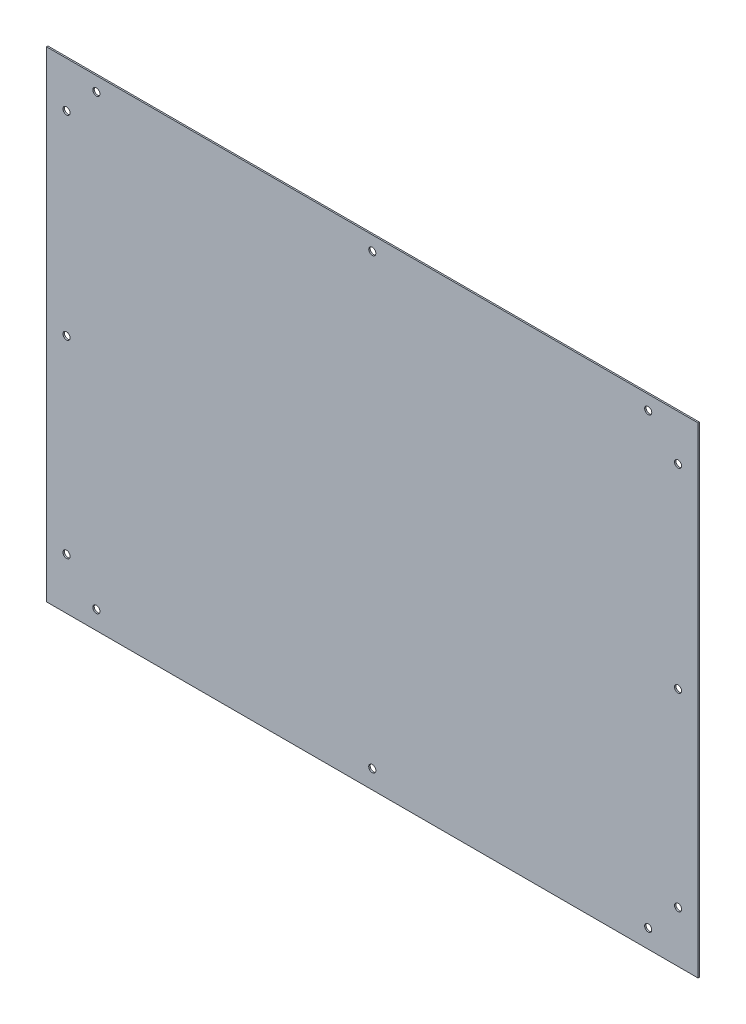
ISO-10303-21;
HEADER;
FILE_DESCRIPTION(('STEP AP214'),'2;1');
FILE_NAME('part.step','',(''),(''),'','','');
FILE_SCHEMA(('AUTOMOTIVE_DESIGN { 1 0 10303 214 1 1 1 1 }'));
ENDSEC;
DATA;
#1=APPLICATION_CONTEXT('core data for automotive mechanical design processes');
#2=APPLICATION_PROTOCOL_DEFINITION('international standard','automotive_design',2000,#1);
#3=PRODUCT_CONTEXT('',#1,'mechanical');
#4=PRODUCT('Part','Part','',(#3));
#5=PRODUCT_RELATED_PRODUCT_CATEGORY('part','',(#4));
#6=PRODUCT_DEFINITION_FORMATION('','',#4);
#7=PRODUCT_DEFINITION_CONTEXT('part definition',#1,'design');
#8=PRODUCT_DEFINITION('design','',#6,#7);
#9=PRODUCT_DEFINITION_SHAPE('','',#8);
#10=(LENGTH_UNIT() NAMED_UNIT(*) SI_UNIT(.MILLI.,.METRE.));
#11=(NAMED_UNIT(*) PLANE_ANGLE_UNIT() SI_UNIT($,.RADIAN.));
#12=(NAMED_UNIT(*) SI_UNIT($,.STERADIAN.) SOLID_ANGLE_UNIT());
#13=UNCERTAINTY_MEASURE_WITH_UNIT(LENGTH_MEASURE(1.E-05),#10,'distance_accuracy_value','');
#14=(GEOMETRIC_REPRESENTATION_CONTEXT(3) GLOBAL_UNCERTAINTY_ASSIGNED_CONTEXT((#13)) GLOBAL_UNIT_ASSIGNED_CONTEXT((#10,
#11,#12)) REPRESENTATION_CONTEXT('',''));
#15=CARTESIAN_POINT('',(0.,0.,0.));
#16=DIRECTION('',(0.,0.,1.));
#17=DIRECTION('',(1.,0.,0.));
#18=AXIS2_PLACEMENT_3D('',#15,#16,#17);
#19=CARTESIAN_POINT('',(229.,169.,1.));
#20=DIRECTION('',(-1.,0.,0.));
#21=DIRECTION('',(0.,-1.,0.));
#22=AXIS2_PLACEMENT_3D('',#19,#20,#21);
#23=PLANE('',#22);
#24=DIRECTION('',(0.,1.,0.));
#25=VECTOR('',#24,1.);
#26=CARTESIAN_POINT('',(229.,169.,0.));
#27=LINE('',#26,#25);
#28=CARTESIAN_POINT('',(229.,-169.,0.));
#29=VERTEX_POINT('',#28);
#30=CARTESIAN_POINT('',(229.,169.,0.));
#31=VERTEX_POINT('',#30);
#32=EDGE_CURVE('E112',#29,#31,#27,.T.);
#33=ORIENTED_EDGE('',*,*,#32,.T.);
#34=DIRECTION('',(0.,0.,-1.));
#35=VECTOR('',#34,1.);
#36=CARTESIAN_POINT('',(229.,169.,1.));
#37=LINE('',#36,#35);
#38=CARTESIAN_POINT('',(229.,169.,1.));
#39=VERTEX_POINT('',#38);
#40=EDGE_CURVE('E11',#39,#31,#37,.T.);
#41=ORIENTED_EDGE('',*,*,#40,.F.);
#42=DIRECTION('',(0.,1.,0.));
#43=VECTOR('',#42,1.);
#44=CARTESIAN_POINT('',(229.,169.,1.));
#45=LINE('',#44,#43);
#46=CARTESIAN_POINT('',(229.,-169.,1.));
#47=VERTEX_POINT('',#46);
#48=EDGE_CURVE('E96',#47,#39,#45,.T.);
#49=ORIENTED_EDGE('',*,*,#48,.F.);
#50=DIRECTION('',(0.,0.,-1.));
#51=VECTOR('',#50,1.);
#52=CARTESIAN_POINT('',(229.,-169.,1.));
#53=LINE('',#52,#51);
#54=EDGE_CURVE('E108',#47,#29,#53,.T.);
#55=ORIENTED_EDGE('',*,*,#54,.T.);
#56=EDGE_LOOP('',(#33,#41,#49,#55));
#57=FACE_BOUND('',#56,.T.);
#58=ADVANCED_FACE('F44',(#57),#23,.F.);
#59=CARTESIAN_POINT('',(-229.,169.,1.));
#60=DIRECTION('',(0.,-1.,0.));
#61=DIRECTION('',(0.,0.,-1.));
#62=AXIS2_PLACEMENT_3D('',#59,#60,#61);
#63=PLANE('',#62);
#64=DIRECTION('',(-1.,0.,0.));
#65=VECTOR('',#64,1.);
#66=CARTESIAN_POINT('',(-229.,169.,0.));
#67=LINE('',#66,#65);
#68=CARTESIAN_POINT('',(-229.,169.,0.));
#69=VERTEX_POINT('',#68);
#70=EDGE_CURVE('E101',#31,#69,#67,.T.);
#71=ORIENTED_EDGE('',*,*,#70,.T.);
#72=DIRECTION('',(0.,0.,-1.));
#73=VECTOR('',#72,1.);
#74=CARTESIAN_POINT('',(-229.,169.,1.));
#75=LINE('',#74,#73);
#76=CARTESIAN_POINT('',(-229.,169.,1.));
#77=VERTEX_POINT('',#76);
#78=EDGE_CURVE('E53',#77,#69,#75,.T.);
#79=ORIENTED_EDGE('',*,*,#78,.F.);
#80=DIRECTION('',(-1.,0.,0.));
#81=VECTOR('',#80,1.);
#82=CARTESIAN_POINT('',(-229.,169.,1.));
#83=LINE('',#82,#81);
#84=EDGE_CURVE('E91',#39,#77,#83,.T.);
#85=ORIENTED_EDGE('',*,*,#84,.F.);
#86=ORIENTED_EDGE('',*,*,#40,.T.);
#87=EDGE_LOOP('',(#71,#79,#85,#86));
#88=FACE_BOUND('',#87,.T.);
#89=ADVANCED_FACE('F100',(#88),#63,.F.);
#90=CARTESIAN_POINT('',(-229.,169.,1.));
#91=DIRECTION('',(1.,0.,0.));
#92=DIRECTION('',(0.,0.,-1.));
#93=AXIS2_PLACEMENT_3D('',#90,#91,#92);
#94=PLANE('',#93);
#95=DIRECTION('',(0.,-1.,0.));
#96=VECTOR('',#95,1.);
#97=CARTESIAN_POINT('',(-229.,169.,0.));
#98=LINE('',#97,#96);
#99=CARTESIAN_POINT('',(-229.,-169.,0.));
#100=VERTEX_POINT('',#99);
#101=EDGE_CURVE('E78',#69,#100,#98,.T.);
#102=ORIENTED_EDGE('',*,*,#101,.T.);
#103=DIRECTION('',(0.,0.,-1.));
#104=VECTOR('',#103,1.);
#105=CARTESIAN_POINT('',(-229.,-169.,1.));
#106=LINE('',#105,#104);
#107=CARTESIAN_POINT('',(-229.,-169.,1.));
#108=VERTEX_POINT('',#107);
#109=EDGE_CURVE('E103',#108,#100,#106,.T.);
#110=ORIENTED_EDGE('',*,*,#109,.F.);
#111=DIRECTION('',(0.,-1.,0.));
#112=VECTOR('',#111,1.);
#113=CARTESIAN_POINT('',(-229.,169.,1.));
#114=LINE('',#113,#112);
#115=EDGE_CURVE('E94',#77,#108,#114,.T.);
#116=ORIENTED_EDGE('',*,*,#115,.F.);
#117=ORIENTED_EDGE('',*,*,#78,.T.);
#118=EDGE_LOOP('',(#102,#110,#116,#117));
#119=FACE_BOUND('',#118,.T.);
#120=ADVANCED_FACE('F104',(#119),#94,.F.);
#121=CARTESIAN_POINT('',(-229.,-169.,1.));
#122=DIRECTION('',(0.,1.,0.));
#123=DIRECTION('',(0.,0.,1.));
#124=AXIS2_PLACEMENT_3D('',#121,#122,#123);
#125=PLANE('',#124);
#126=DIRECTION('',(1.,0.,0.));
#127=VECTOR('',#126,1.);
#128=CARTESIAN_POINT('',(-229.,-169.,0.));
#129=LINE('',#128,#127);
#130=EDGE_CURVE('E84',#100,#29,#129,.T.);
#131=ORIENTED_EDGE('',*,*,#130,.T.);
#132=ORIENTED_EDGE('',*,*,#54,.F.);
#133=DIRECTION('',(1.,0.,0.));
#134=VECTOR('',#133,1.);
#135=CARTESIAN_POINT('',(-229.,-169.,1.));
#136=LINE('',#135,#134);
#137=EDGE_CURVE('E61',#108,#47,#136,.T.);
#138=ORIENTED_EDGE('',*,*,#137,.F.);
#139=ORIENTED_EDGE('',*,*,#109,.T.);
#140=EDGE_LOOP('',(#131,#132,#138,#139));
#141=FACE_BOUND('',#140,.T.);
#142=ADVANCED_FACE('F126',(#141),#125,.F.);
#143=CARTESIAN_POINT('',(0.,0.,1.));
#144=DIRECTION('',(0.,0.,1.));
#145=DIRECTION('',(1.,0.,0.));
#146=AXIS2_PLACEMENT_3D('',#143,#144,#145);
#147=PLANE('',#146);
#148=CARTESIAN_POINT('',(215.,-133.,1.));
#149=DIRECTION('',(0.,0.,1.));
#150=DIRECTION('',(1.,0.,0.));
#151=AXIS2_PLACEMENT_3D('',#148,#149,#150);
#152=CIRCLE('',#151,2.50000000000002);
#153=CARTESIAN_POINT('',(217.5,-133.,1.));
#154=VERTEX_POINT('',#153);
#155=EDGE_CURVE('E177',#154,#154,#152,.T.);
#156=ORIENTED_EDGE('',*,*,#155,.F.);
#157=EDGE_LOOP('',(#156));
#158=FACE_BOUND('',#157,.T.);
#159=CARTESIAN_POINT('',(215.,0.,1.));
#160=DIRECTION('',(0.,0.,1.));
#161=DIRECTION('',(1.,0.,0.));
#162=AXIS2_PLACEMENT_3D('',#159,#160,#161);
#163=CIRCLE('',#162,2.50000000000002);
#164=CARTESIAN_POINT('',(217.5,0.,1.));
#165=VERTEX_POINT('',#164);
#166=EDGE_CURVE('E186',#165,#165,#163,.T.);
#167=ORIENTED_EDGE('',*,*,#166,.F.);
#168=EDGE_LOOP('',(#167));
#169=FACE_BOUND('',#168,.T.);
#170=CARTESIAN_POINT('',(-215.,137.,1.));
#171=DIRECTION('',(0.,0.,1.));
#172=DIRECTION('',(1.,0.,0.));
#173=AXIS2_PLACEMENT_3D('',#170,#171,#172);
#174=CIRCLE('',#173,2.49999999999997);
#175=CARTESIAN_POINT('',(-212.5,137.,1.));
#176=VERTEX_POINT('',#175);
#177=EDGE_CURVE('E194',#176,#176,#174,.T.);
#178=ORIENTED_EDGE('',*,*,#177,.F.);
#179=EDGE_LOOP('',(#178));
#180=FACE_BOUND('',#179,.T.);
#181=CARTESIAN_POINT('',(-215.,-133.,1.));
#182=DIRECTION('',(0.,0.,1.));
#183=DIRECTION('',(1.,0.,0.));
#184=AXIS2_PLACEMENT_3D('',#181,#182,#183);
#185=CIRCLE('',#184,2.49999999999935);
#186=CARTESIAN_POINT('',(-212.500000000001,-133.,1.));
#187=VERTEX_POINT('',#186);
#188=EDGE_CURVE('E146',#187,#187,#185,.T.);
#189=ORIENTED_EDGE('',*,*,#188,.F.);
#190=EDGE_LOOP('',(#189));
#191=FACE_BOUND('',#190,.T.);
#192=CARTESIAN_POINT('',(-215.,0.,1.));
#193=DIRECTION('',(0.,0.,1.));
#194=DIRECTION('',(1.,0.,0.));
#195=AXIS2_PLACEMENT_3D('',#192,#193,#194);
#196=CIRCLE('',#195,2.49999999999997);
#197=CARTESIAN_POINT('',(-212.5,0.,1.));
#198=VERTEX_POINT('',#197);
#199=EDGE_CURVE('E145',#198,#198,#196,.T.);
#200=ORIENTED_EDGE('',*,*,#199,.F.);
#201=EDGE_LOOP('',(#200));
#202=FACE_BOUND('',#201,.T.);
#203=CARTESIAN_POINT('',(194.,159.,1.));
#204=DIRECTION('',(0.,0.,1.));
#205=DIRECTION('',(1.,0.,0.));
#206=AXIS2_PLACEMENT_3D('',#203,#204,#205);
#207=CIRCLE('',#206,2.50000000000026);
#208=CARTESIAN_POINT('',(196.5,159.,1.));
#209=VERTEX_POINT('',#208);
#210=EDGE_CURVE('E154',#209,#209,#207,.T.);
#211=ORIENTED_EDGE('',*,*,#210,.F.);
#212=EDGE_LOOP('',(#211));
#213=FACE_BOUND('',#212,.T.);
#214=CARTESIAN_POINT('',(193.997422663292,-156.,1.));
#215=DIRECTION('',(0.,0.,1.));
#216=DIRECTION('',(1.,0.,0.));
#217=AXIS2_PLACEMENT_3D('',#214,#215,#216);
#218=CIRCLE('',#217,2.50000000000008);
#219=CARTESIAN_POINT('',(196.497422663292,-156.,1.));
#220=VERTEX_POINT('',#219);
#221=EDGE_CURVE('E162',#220,#220,#218,.T.);
#222=ORIENTED_EDGE('',*,*,#221,.F.);
#223=EDGE_LOOP('',(#222));
#224=FACE_BOUND('',#223,.T.);
#225=CARTESIAN_POINT('',(-194.002577336708,-156.,1.));
#226=DIRECTION('',(0.,0.,1.));
#227=DIRECTION('',(1.,0.,0.));
#228=AXIS2_PLACEMENT_3D('',#225,#226,#227);
#229=CIRCLE('',#228,2.50000000000002);
#230=CARTESIAN_POINT('',(-191.502577336708,-156.,1.));
#231=VERTEX_POINT('',#230);
#232=EDGE_CURVE('E137',#231,#231,#229,.T.);
#233=ORIENTED_EDGE('',*,*,#232,.F.);
#234=EDGE_LOOP('',(#233));
#235=FACE_BOUND('',#234,.T.);
#236=CARTESIAN_POINT('',(215.,137.,1.));
#237=DIRECTION('',(0.,0.,1.));
#238=DIRECTION('',(1.,0.,0.));
#239=AXIS2_PLACEMENT_3D('',#236,#237,#238);
#240=CIRCLE('',#239,2.50000000000002);
#241=CARTESIAN_POINT('',(217.5,137.,1.));
#242=VERTEX_POINT('',#241);
#243=EDGE_CURVE('E178',#242,#242,#240,.T.);
#244=ORIENTED_EDGE('',*,*,#243,.F.);
#245=EDGE_LOOP('',(#244));
#246=FACE_BOUND('',#245,.T.);
#247=CARTESIAN_POINT('',(0.,159.,1.));
#248=DIRECTION('',(0.,0.,1.));
#249=DIRECTION('',(1.,0.,0.));
#250=AXIS2_PLACEMENT_3D('',#247,#248,#249);
#251=CIRCLE('',#250,2.5);
#252=CARTESIAN_POINT('',(2.49999999999996,159.,1.));
#253=VERTEX_POINT('',#252);
#254=EDGE_CURVE('E217',#253,#253,#251,.T.);
#255=ORIENTED_EDGE('',*,*,#254,.F.);
#256=EDGE_LOOP('',(#255));
#257=FACE_BOUND('',#256,.T.);
#258=CARTESIAN_POINT('',(-0.00257733670794291,-156.,1.));
#259=DIRECTION('',(0.,0.,1.));
#260=DIRECTION('',(1.,0.,0.));
#261=AXIS2_PLACEMENT_3D('',#258,#259,#260);
#262=CIRCLE('',#261,2.50000000000001);
#263=CARTESIAN_POINT('',(2.49742266329207,-156.,1.));
#264=VERTEX_POINT('',#263);
#265=EDGE_CURVE('E209',#264,#264,#262,.T.);
#266=ORIENTED_EDGE('',*,*,#265,.F.);
#267=EDGE_LOOP('',(#266));
#268=FACE_BOUND('',#267,.T.);
#269=CARTESIAN_POINT('',(-194.,159.,1.));
#270=DIRECTION('',(0.,0.,1.));
#271=DIRECTION('',(1.,0.,0.));
#272=AXIS2_PLACEMENT_3D('',#269,#270,#271);
#273=CIRCLE('',#272,2.49999999999997);
#274=CARTESIAN_POINT('',(-191.5,159.,1.));
#275=VERTEX_POINT('',#274);
#276=EDGE_CURVE('E133',#275,#275,#273,.T.);
#277=ORIENTED_EDGE('',*,*,#276,.F.);
#278=EDGE_LOOP('',(#277));
#279=FACE_BOUND('',#278,.T.);
#280=ORIENTED_EDGE('',*,*,#48,.T.);
#281=ORIENTED_EDGE('',*,*,#84,.T.);
#282=ORIENTED_EDGE('',*,*,#115,.T.);
#283=ORIENTED_EDGE('',*,*,#137,.T.);
#284=EDGE_LOOP('',(#280,#281,#282,#283));
#285=FACE_BOUND('',#284,.T.);
#286=ADVANCED_FACE('F92',(#158,#169,#180,#191,#202,#213,#224,#235,#246,#257,#268,#279,#285),
#147,.T.);
#287=CARTESIAN_POINT('',(0.,0.,0.));
#288=DIRECTION('',(0.,0.,1.));
#289=DIRECTION('',(1.,0.,0.));
#290=AXIS2_PLACEMENT_3D('',#287,#288,#289);
#291=PLANE('',#290);
#292=CARTESIAN_POINT('',(215.,-133.,0.));
#293=DIRECTION('',(0.,0.,1.));
#294=DIRECTION('',(1.,0.,0.));
#295=AXIS2_PLACEMENT_3D('',#292,#293,#294);
#296=CIRCLE('',#295,2.50000000000002);
#297=CARTESIAN_POINT('',(217.5,-133.,0.));
#298=VERTEX_POINT('',#297);
#299=EDGE_CURVE('E173',#298,#298,#296,.T.);
#300=ORIENTED_EDGE('',*,*,#299,.T.);
#301=EDGE_LOOP('',(#300));
#302=FACE_BOUND('',#301,.T.);
#303=CARTESIAN_POINT('',(215.,0.,0.));
#304=DIRECTION('',(0.,0.,1.));
#305=DIRECTION('',(1.,0.,0.));
#306=AXIS2_PLACEMENT_3D('',#303,#304,#305);
#307=CIRCLE('',#306,2.50000000000002);
#308=CARTESIAN_POINT('',(217.5,0.,0.));
#309=VERTEX_POINT('',#308);
#310=EDGE_CURVE('E182',#309,#309,#307,.T.);
#311=ORIENTED_EDGE('',*,*,#310,.T.);
#312=EDGE_LOOP('',(#311));
#313=FACE_BOUND('',#312,.T.);
#314=CARTESIAN_POINT('',(-215.,137.,0.));
#315=DIRECTION('',(0.,0.,1.));
#316=DIRECTION('',(1.,0.,0.));
#317=AXIS2_PLACEMENT_3D('',#314,#315,#316);
#318=CIRCLE('',#317,2.49999999999997);
#319=CARTESIAN_POINT('',(-212.5,137.,0.));
#320=VERTEX_POINT('',#319);
#321=EDGE_CURVE('E190',#320,#320,#318,.T.);
#322=ORIENTED_EDGE('',*,*,#321,.T.);
#323=EDGE_LOOP('',(#322));
#324=FACE_BOUND('',#323,.T.);
#325=CARTESIAN_POINT('',(-215.,-133.,0.));
#326=DIRECTION('',(0.,0.,1.));
#327=DIRECTION('',(1.,0.,0.));
#328=AXIS2_PLACEMENT_3D('',#325,#326,#327);
#329=CIRCLE('',#328,2.49999999999935);
#330=CARTESIAN_POINT('',(-212.500000000001,-133.,0.));
#331=VERTEX_POINT('',#330);
#332=EDGE_CURVE('E198',#331,#331,#329,.T.);
#333=ORIENTED_EDGE('',*,*,#332,.T.);
#334=EDGE_LOOP('',(#333));
#335=FACE_BOUND('',#334,.T.);
#336=CARTESIAN_POINT('',(-215.,0.,0.));
#337=DIRECTION('',(0.,0.,1.));
#338=DIRECTION('',(1.,0.,0.));
#339=AXIS2_PLACEMENT_3D('',#336,#337,#338);
#340=CIRCLE('',#339,2.49999999999997);
#341=CARTESIAN_POINT('',(-212.5,0.,0.));
#342=VERTEX_POINT('',#341);
#343=EDGE_CURVE('E141',#342,#342,#340,.T.);
#344=ORIENTED_EDGE('',*,*,#343,.T.);
#345=EDGE_LOOP('',(#344));
#346=FACE_BOUND('',#345,.T.);
#347=CARTESIAN_POINT('',(194.,159.,0.));
#348=DIRECTION('',(0.,0.,1.));
#349=DIRECTION('',(1.,0.,0.));
#350=AXIS2_PLACEMENT_3D('',#347,#348,#349);
#351=CIRCLE('',#350,2.50000000000026);
#352=CARTESIAN_POINT('',(196.5,159.,0.));
#353=VERTEX_POINT('',#352);
#354=EDGE_CURVE('E150',#353,#353,#351,.T.);
#355=ORIENTED_EDGE('',*,*,#354,.T.);
#356=EDGE_LOOP('',(#355));
#357=FACE_BOUND('',#356,.T.);
#358=CARTESIAN_POINT('',(193.997422663292,-156.,0.));
#359=DIRECTION('',(0.,0.,1.));
#360=DIRECTION('',(1.,0.,0.));
#361=AXIS2_PLACEMENT_3D('',#358,#359,#360);
#362=CIRCLE('',#361,2.50000000000008);
#363=CARTESIAN_POINT('',(196.497422663292,-156.,0.));
#364=VERTEX_POINT('',#363);
#365=EDGE_CURVE('E158',#364,#364,#362,.T.);
#366=ORIENTED_EDGE('',*,*,#365,.T.);
#367=EDGE_LOOP('',(#366));
#368=FACE_BOUND('',#367,.T.);
#369=CARTESIAN_POINT('',(-194.002577336708,-156.,0.));
#370=DIRECTION('',(0.,0.,1.));
#371=DIRECTION('',(1.,0.,0.));
#372=AXIS2_PLACEMENT_3D('',#369,#370,#371);
#373=CIRCLE('',#372,2.50000000000002);
#374=CARTESIAN_POINT('',(-191.502577336708,-156.,0.));
#375=VERTEX_POINT('',#374);
#376=EDGE_CURVE('E166',#375,#375,#373,.T.);
#377=ORIENTED_EDGE('',*,*,#376,.T.);
#378=EDGE_LOOP('',(#377));
#379=FACE_BOUND('',#378,.T.);
#380=CARTESIAN_POINT('',(215.,137.,0.));
#381=DIRECTION('',(0.,0.,1.));
#382=DIRECTION('',(1.,0.,0.));
#383=AXIS2_PLACEMENT_3D('',#380,#381,#382);
#384=CIRCLE('',#383,2.50000000000002);
#385=CARTESIAN_POINT('',(217.5,137.,0.));
#386=VERTEX_POINT('',#385);
#387=EDGE_CURVE('E221',#386,#386,#384,.T.);
#388=ORIENTED_EDGE('',*,*,#387,.T.);
#389=EDGE_LOOP('',(#388));
#390=FACE_BOUND('',#389,.T.);
#391=CARTESIAN_POINT('',(0.,159.,0.));
#392=DIRECTION('',(0.,0.,1.));
#393=DIRECTION('',(1.,0.,0.));
#394=AXIS2_PLACEMENT_3D('',#391,#392,#393);
#395=CIRCLE('',#394,2.5);
#396=CARTESIAN_POINT('',(2.49999999999996,159.,0.));
#397=VERTEX_POINT('',#396);
#398=EDGE_CURVE('E213',#397,#397,#395,.T.);
#399=ORIENTED_EDGE('',*,*,#398,.T.);
#400=EDGE_LOOP('',(#399));
#401=FACE_BOUND('',#400,.T.);
#402=CARTESIAN_POINT('',(-0.00257733670794291,-156.,0.));
#403=DIRECTION('',(0.,0.,1.));
#404=DIRECTION('',(1.,0.,0.));
#405=AXIS2_PLACEMENT_3D('',#402,#403,#404);
#406=CIRCLE('',#405,2.50000000000001);
#407=CARTESIAN_POINT('',(2.49742266329207,-156.,0.));
#408=VERTEX_POINT('',#407);
#409=EDGE_CURVE('E205',#408,#408,#406,.T.);
#410=ORIENTED_EDGE('',*,*,#409,.T.);
#411=EDGE_LOOP('',(#410));
#412=FACE_BOUND('',#411,.T.);
#413=CARTESIAN_POINT('',(-194.,159.,0.));
#414=DIRECTION('',(0.,0.,1.));
#415=DIRECTION('',(1.,0.,0.));
#416=AXIS2_PLACEMENT_3D('',#413,#414,#415);
#417=CIRCLE('',#416,2.49999999999997);
#418=CARTESIAN_POINT('',(-191.5,159.,0.));
#419=VERTEX_POINT('',#418);
#420=EDGE_CURVE('E116',#419,#419,#417,.T.);
#421=ORIENTED_EDGE('',*,*,#420,.T.);
#422=EDGE_LOOP('',(#421));
#423=FACE_BOUND('',#422,.T.);
#424=ORIENTED_EDGE('',*,*,#32,.F.);
#425=ORIENTED_EDGE('',*,*,#130,.F.);
#426=ORIENTED_EDGE('',*,*,#101,.F.);
#427=ORIENTED_EDGE('',*,*,#70,.F.);
#428=EDGE_LOOP('',(#424,#425,#426,#427));
#429=FACE_BOUND('',#428,.T.);
#430=ADVANCED_FACE('F129',(#302,#313,#324,#335,#346,#357,#368,#379,#390,#401,#412,#423,#429),
#291,.F.);
#431=CARTESIAN_POINT('',(-194.,159.,0.));
#432=DIRECTION('',(0.,0.,1.));
#433=DIRECTION('',(1.,0.,0.));
#434=AXIS2_PLACEMENT_3D('',#431,#432,#433);
#435=CYLINDRICAL_SURFACE('',#434,2.49999999999997);
#436=ORIENTED_EDGE('',*,*,#420,.F.);
#437=EDGE_LOOP('',(#436));
#438=FACE_BOUND('',#437,.T.);
#439=ORIENTED_EDGE('',*,*,#276,.T.);
#440=EDGE_LOOP('',(#439));
#441=FACE_BOUND('',#440,.T.);
#442=ADVANCED_FACE('F241',(#438,#441),#435,.F.);
#443=CARTESIAN_POINT('',(-0.00257733670794291,-156.,0.));
#444=DIRECTION('',(0.,0.,1.));
#445=DIRECTION('',(1.,0.,0.));
#446=AXIS2_PLACEMENT_3D('',#443,#444,#445);
#447=CYLINDRICAL_SURFACE('',#446,2.50000000000001);
#448=ORIENTED_EDGE('',*,*,#409,.F.);
#449=EDGE_LOOP('',(#448));
#450=FACE_BOUND('',#449,.T.);
#451=ORIENTED_EDGE('',*,*,#265,.T.);
#452=EDGE_LOOP('',(#451));
#453=FACE_BOUND('',#452,.T.);
#454=ADVANCED_FACE('F243',(#450,#453),#447,.F.);
#455=CARTESIAN_POINT('',(0.,159.,0.));
#456=DIRECTION('',(0.,0.,1.));
#457=DIRECTION('',(1.,0.,0.));
#458=AXIS2_PLACEMENT_3D('',#455,#456,#457);
#459=CYLINDRICAL_SURFACE('',#458,2.5);
#460=ORIENTED_EDGE('',*,*,#398,.F.);
#461=EDGE_LOOP('',(#460));
#462=FACE_BOUND('',#461,.T.);
#463=ORIENTED_EDGE('',*,*,#254,.T.);
#464=EDGE_LOOP('',(#463));
#465=FACE_BOUND('',#464,.T.);
#466=ADVANCED_FACE('F250',(#462,#465),#459,.F.);
#467=CARTESIAN_POINT('',(215.,137.,0.));
#468=DIRECTION('',(0.,0.,1.));
#469=DIRECTION('',(1.,0.,0.));
#470=AXIS2_PLACEMENT_3D('',#467,#468,#469);
#471=CYLINDRICAL_SURFACE('',#470,2.50000000000002);
#472=ORIENTED_EDGE('',*,*,#387,.F.);
#473=EDGE_LOOP('',(#472));
#474=FACE_BOUND('',#473,.T.);
#475=ORIENTED_EDGE('',*,*,#243,.T.);
#476=EDGE_LOOP('',(#475));
#477=FACE_BOUND('',#476,.T.);
#478=ADVANCED_FACE('F229',(#474,#477),#471,.F.);
#479=CARTESIAN_POINT('',(-194.002577336708,-156.,0.));
#480=DIRECTION('',(0.,0.,1.));
#481=DIRECTION('',(1.,0.,0.));
#482=AXIS2_PLACEMENT_3D('',#479,#480,#481);
#483=CYLINDRICAL_SURFACE('',#482,2.50000000000002);
#484=ORIENTED_EDGE('',*,*,#376,.F.);
#485=EDGE_LOOP('',(#484));
#486=FACE_BOUND('',#485,.T.);
#487=ORIENTED_EDGE('',*,*,#232,.T.);
#488=EDGE_LOOP('',(#487));
#489=FACE_BOUND('',#488,.T.);
#490=ADVANCED_FACE('F311',(#486,#489),#483,.F.);
#491=CARTESIAN_POINT('',(193.997422663292,-156.,0.));
#492=DIRECTION('',(0.,0.,1.));
#493=DIRECTION('',(1.,0.,0.));
#494=AXIS2_PLACEMENT_3D('',#491,#492,#493);
#495=CYLINDRICAL_SURFACE('',#494,2.50000000000008);
#496=ORIENTED_EDGE('',*,*,#365,.F.);
#497=EDGE_LOOP('',(#496));
#498=FACE_BOUND('',#497,.T.);
#499=ORIENTED_EDGE('',*,*,#221,.T.);
#500=EDGE_LOOP('',(#499));
#501=FACE_BOUND('',#500,.T.);
#502=ADVANCED_FACE('F322',(#498,#501),#495,.F.);
#503=CARTESIAN_POINT('',(194.,159.,0.));
#504=DIRECTION('',(0.,0.,1.));
#505=DIRECTION('',(1.,0.,0.));
#506=AXIS2_PLACEMENT_3D('',#503,#504,#505);
#507=CYLINDRICAL_SURFACE('',#506,2.50000000000026);
#508=ORIENTED_EDGE('',*,*,#354,.F.);
#509=EDGE_LOOP('',(#508));
#510=FACE_BOUND('',#509,.T.);
#511=ORIENTED_EDGE('',*,*,#210,.T.);
#512=EDGE_LOOP('',(#511));
#513=FACE_BOUND('',#512,.T.);
#514=ADVANCED_FACE('F333',(#510,#513),#507,.F.);
#515=CARTESIAN_POINT('',(-215.,0.,0.));
#516=DIRECTION('',(0.,0.,1.));
#517=DIRECTION('',(1.,0.,0.));
#518=AXIS2_PLACEMENT_3D('',#515,#516,#517);
#519=CYLINDRICAL_SURFACE('',#518,2.49999999999997);
#520=ORIENTED_EDGE('',*,*,#343,.F.);
#521=EDGE_LOOP('',(#520));
#522=FACE_BOUND('',#521,.T.);
#523=ORIENTED_EDGE('',*,*,#199,.T.);
#524=EDGE_LOOP('',(#523));
#525=FACE_BOUND('',#524,.T.);
#526=ADVANCED_FACE('F344',(#522,#525),#519,.F.);
#527=CARTESIAN_POINT('',(-215.,-133.,0.));
#528=DIRECTION('',(0.,0.,1.));
#529=DIRECTION('',(1.,0.,0.));
#530=AXIS2_PLACEMENT_3D('',#527,#528,#529);
#531=CYLINDRICAL_SURFACE('',#530,2.49999999999935);
#532=ORIENTED_EDGE('',*,*,#332,.F.);
#533=EDGE_LOOP('',(#532));
#534=FACE_BOUND('',#533,.T.);
#535=ORIENTED_EDGE('',*,*,#188,.T.);
#536=EDGE_LOOP('',(#535));
#537=FACE_BOUND('',#536,.T.);
#538=ADVANCED_FACE('F355',(#534,#537),#531,.F.);
#539=CARTESIAN_POINT('',(-215.,137.,0.));
#540=DIRECTION('',(0.,0.,1.));
#541=DIRECTION('',(1.,0.,0.));
#542=AXIS2_PLACEMENT_3D('',#539,#540,#541);
#543=CYLINDRICAL_SURFACE('',#542,2.49999999999997);
#544=ORIENTED_EDGE('',*,*,#321,.F.);
#545=EDGE_LOOP('',(#544));
#546=FACE_BOUND('',#545,.T.);
#547=ORIENTED_EDGE('',*,*,#177,.T.);
#548=EDGE_LOOP('',(#547));
#549=FACE_BOUND('',#548,.T.);
#550=ADVANCED_FACE('F365',(#546,#549),#543,.F.);
#551=CARTESIAN_POINT('',(215.,0.,0.));
#552=DIRECTION('',(0.,0.,1.));
#553=DIRECTION('',(1.,0.,0.));
#554=AXIS2_PLACEMENT_3D('',#551,#552,#553);
#555=CYLINDRICAL_SURFACE('',#554,2.50000000000002);
#556=ORIENTED_EDGE('',*,*,#310,.F.);
#557=EDGE_LOOP('',(#556));
#558=FACE_BOUND('',#557,.T.);
#559=ORIENTED_EDGE('',*,*,#166,.T.);
#560=EDGE_LOOP('',(#559));
#561=FACE_BOUND('',#560,.T.);
#562=ADVANCED_FACE('F376',(#558,#561),#555,.F.);
#563=CARTESIAN_POINT('',(215.,-133.,0.));
#564=DIRECTION('',(0.,0.,1.));
#565=DIRECTION('',(1.,0.,0.));
#566=AXIS2_PLACEMENT_3D('',#563,#564,#565);
#567=CYLINDRICAL_SURFACE('',#566,2.50000000000002);
#568=ORIENTED_EDGE('',*,*,#299,.F.);
#569=EDGE_LOOP('',(#568));
#570=FACE_BOUND('',#569,.T.);
#571=ORIENTED_EDGE('',*,*,#155,.T.);
#572=EDGE_LOOP('',(#571));
#573=FACE_BOUND('',#572,.T.);
#574=ADVANCED_FACE('F387',(#570,#573),#567,.F.);
#575=CLOSED_SHELL('',(#58,#89,#120,#142,#286,#430,#442,#454,#466,#478,#490,#502,#514,#526,#538,
#550,#562,#574));
#576=MANIFOLD_SOLID_BREP('B2',#575);
#577=ADVANCED_BREP_SHAPE_REPRESENTATION('',(#18,#576),#14);
#578=SHAPE_DEFINITION_REPRESENTATION(#9,#577);
ENDSEC;
END-ISO-10303-21;
